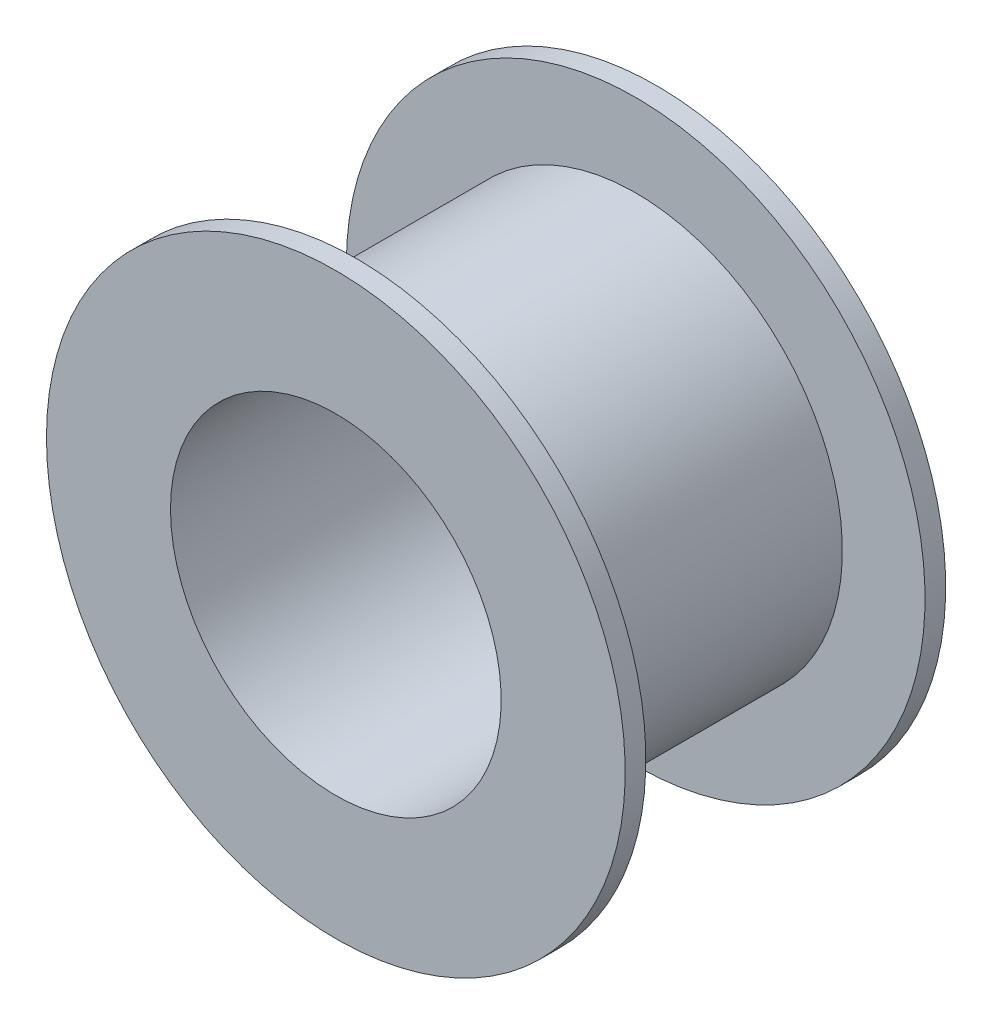
ISO-10303-21;
HEADER;
FILE_DESCRIPTION(('STEP AP214'),'2;1');
FILE_NAME('part.step','',(''),(''),'','','');
FILE_SCHEMA(('AUTOMOTIVE_DESIGN { 1 0 10303 214 1 1 1 1 }'));
ENDSEC;
DATA;
#1=APPLICATION_CONTEXT('core data for automotive mechanical design processes');
#2=APPLICATION_PROTOCOL_DEFINITION('international standard','automotive_design',2000,#1);
#3=PRODUCT_CONTEXT('',#1,'mechanical');
#4=PRODUCT('Part','Part','',(#3));
#5=PRODUCT_RELATED_PRODUCT_CATEGORY('part','',(#4));
#6=PRODUCT_DEFINITION_FORMATION('','',#4);
#7=PRODUCT_DEFINITION_CONTEXT('part definition',#1,'design');
#8=PRODUCT_DEFINITION('design','',#6,#7);
#9=PRODUCT_DEFINITION_SHAPE('','',#8);
#10=(LENGTH_UNIT() NAMED_UNIT(*) SI_UNIT(.MILLI.,.METRE.));
#11=(NAMED_UNIT(*) PLANE_ANGLE_UNIT() SI_UNIT($,.RADIAN.));
#12=(NAMED_UNIT(*) SI_UNIT($,.STERADIAN.) SOLID_ANGLE_UNIT());
#13=UNCERTAINTY_MEASURE_WITH_UNIT(LENGTH_MEASURE(1.E-05),#10,'distance_accuracy_value','');
#14=(GEOMETRIC_REPRESENTATION_CONTEXT(3) GLOBAL_UNCERTAINTY_ASSIGNED_CONTEXT((#13)) GLOBAL_UNIT_ASSIGNED_CONTEXT((#10,
#11,#12)) REPRESENTATION_CONTEXT('',''));
#15=CARTESIAN_POINT('',(0.,0.,0.));
#16=DIRECTION('',(0.,0.,1.));
#17=DIRECTION('',(1.,0.,0.));
#18=AXIS2_PLACEMENT_3D('',#15,#16,#17);
#19=CARTESIAN_POINT('',(0.,0.,0.));
#20=DIRECTION('',(0.,0.,-1.));
#21=DIRECTION('',(-1.,0.,0.));
#22=AXIS2_PLACEMENT_3D('',#19,#20,#21);
#23=CYLINDRICAL_SURFACE('',#22,50.8);
#24=CARTESIAN_POINT('',(0.,0.,98.4738461538463));
#25=DIRECTION('',(0.,0.,-1.));
#26=DIRECTION('',(-1.,0.,0.));
#27=AXIS2_PLACEMENT_3D('',#24,#25,#26);
#28=CIRCLE('',#27,50.8);
#29=CARTESIAN_POINT('',(-50.8,0.,98.4738461538463));
#30=VERTEX_POINT('',#29);
#31=EDGE_CURVE('E67',#30,#30,#28,.T.);
#32=ORIENTED_EDGE('',*,*,#31,.F.);
#33=EDGE_LOOP('',(#32));
#34=FACE_BOUND('',#33,.T.);
#35=CARTESIAN_POINT('',(0.,0.,0.));
#36=DIRECTION('',(0.,0.,-1.));
#37=DIRECTION('',(-1.,0.,0.));
#38=AXIS2_PLACEMENT_3D('',#35,#36,#37);
#39=CIRCLE('',#38,50.8);
#40=CARTESIAN_POINT('',(-50.8,0.,0.));
#41=VERTEX_POINT('',#40);
#42=EDGE_CURVE('E10',#41,#41,#39,.T.);
#43=ORIENTED_EDGE('',*,*,#42,.T.);
#44=EDGE_LOOP('',(#43));
#45=FACE_BOUND('',#44,.T.);
#46=ADVANCED_FACE('F39',(#34,#45),#23,.F.);
#47=CARTESIAN_POINT('',(0.,-50.8,0.));
#48=DIRECTION('',(0.,0.,1.));
#49=DIRECTION('',(1.,0.,0.));
#50=AXIS2_PLACEMENT_3D('',#47,#48,#49);
#51=PLANE('',#50);
#52=ORIENTED_EDGE('',*,*,#42,.F.);
#53=EDGE_LOOP('',(#52));
#54=FACE_BOUND('',#53,.T.);
#55=CARTESIAN_POINT('',(0.,0.,0.));
#56=DIRECTION('',(0.,0.,-1.));
#57=DIRECTION('',(-1.,0.,0.));
#58=AXIS2_PLACEMENT_3D('',#55,#56,#57);
#59=CIRCLE('',#58,88.9);
#60=CARTESIAN_POINT('',(-88.9,0.,0.));
#61=VERTEX_POINT('',#60);
#62=EDGE_CURVE('E45',#61,#61,#59,.T.);
#63=ORIENTED_EDGE('',*,*,#62,.T.);
#64=EDGE_LOOP('',(#63));
#65=FACE_BOUND('',#64,.T.);
#66=ADVANCED_FACE('F74',(#54,#65),#51,.F.);
#67=CARTESIAN_POINT('',(0.,0.,0.));
#68=DIRECTION('',(0.,0.,-1.));
#69=DIRECTION('',(-1.,0.,0.));
#70=AXIS2_PLACEMENT_3D('',#67,#68,#69);
#71=CYLINDRICAL_SURFACE('',#70,88.9);
#72=ORIENTED_EDGE('',*,*,#62,.F.);
#73=EDGE_LOOP('',(#72));
#74=FACE_BOUND('',#73,.T.);
#75=CARTESIAN_POINT('',(0.,0.,6.35));
#76=DIRECTION('',(0.,0.,-1.));
#77=DIRECTION('',(-1.,0.,0.));
#78=AXIS2_PLACEMENT_3D('',#75,#76,#77);
#79=CIRCLE('',#78,88.9);
#80=CARTESIAN_POINT('',(-88.9,0.,6.35));
#81=VERTEX_POINT('',#80);
#82=EDGE_CURVE('E49',#81,#81,#79,.T.);
#83=ORIENTED_EDGE('',*,*,#82,.T.);
#84=EDGE_LOOP('',(#83));
#85=FACE_BOUND('',#84,.T.);
#86=ADVANCED_FACE('F78',(#74,#85),#71,.T.);
#87=CARTESIAN_POINT('',(0.,-63.5,6.35));
#88=DIRECTION('',(0.,0.,-1.));
#89=DIRECTION('',(-1.,0.,0.));
#90=AXIS2_PLACEMENT_3D('',#87,#88,#89);
#91=PLANE('',#90);
#92=ORIENTED_EDGE('',*,*,#82,.F.);
#93=EDGE_LOOP('',(#92));
#94=FACE_BOUND('',#93,.T.);
#95=CARTESIAN_POINT('',(0.,0.,6.35));
#96=DIRECTION('',(0.,0.,-1.));
#97=DIRECTION('',(-1.,0.,0.));
#98=AXIS2_PLACEMENT_3D('',#95,#96,#97);
#99=CIRCLE('',#98,63.5);
#100=CARTESIAN_POINT('',(-63.5,0.,6.35));
#101=VERTEX_POINT('',#100);
#102=EDGE_CURVE('E53',#101,#101,#99,.T.);
#103=ORIENTED_EDGE('',*,*,#102,.T.);
#104=EDGE_LOOP('',(#103));
#105=FACE_BOUND('',#104,.T.);
#106=ADVANCED_FACE('F83',(#94,#105),#91,.F.);
#107=CARTESIAN_POINT('',(0.,0.,0.));
#108=DIRECTION('',(0.,0.,-1.));
#109=DIRECTION('',(-1.,0.,0.));
#110=AXIS2_PLACEMENT_3D('',#107,#108,#109);
#111=CYLINDRICAL_SURFACE('',#110,63.5);
#112=ORIENTED_EDGE('',*,*,#102,.F.);
#113=EDGE_LOOP('',(#112));
#114=FACE_BOUND('',#113,.T.);
#115=CARTESIAN_POINT('',(0.,0.,92.1238461538463));
#116=DIRECTION('',(0.,0.,-1.));
#117=DIRECTION('',(-1.,0.,0.));
#118=AXIS2_PLACEMENT_3D('',#115,#116,#117);
#119=CIRCLE('',#118,63.5);
#120=CARTESIAN_POINT('',(-63.5,0.,92.1238461538463));
#121=VERTEX_POINT('',#120);
#122=EDGE_CURVE('E58',#121,#121,#119,.T.);
#123=ORIENTED_EDGE('',*,*,#122,.T.);
#124=EDGE_LOOP('',(#123));
#125=FACE_BOUND('',#124,.T.);
#126=ADVANCED_FACE('F89',(#114,#125),#111,.T.);
#127=CARTESIAN_POINT('',(0.,-88.9,92.1238461538463));
#128=DIRECTION('',(0.,0.,1.));
#129=DIRECTION('',(1.,0.,0.));
#130=AXIS2_PLACEMENT_3D('',#127,#128,#129);
#131=PLANE('',#130);
#132=ORIENTED_EDGE('',*,*,#122,.F.);
#133=EDGE_LOOP('',(#132));
#134=FACE_BOUND('',#133,.T.);
#135=CARTESIAN_POINT('',(0.,0.,92.1238461538463));
#136=DIRECTION('',(0.,0.,-1.));
#137=DIRECTION('',(-1.,0.,0.));
#138=AXIS2_PLACEMENT_3D('',#135,#136,#137);
#139=CIRCLE('',#138,88.9);
#140=CARTESIAN_POINT('',(-88.9,0.,92.1238461538463));
#141=VERTEX_POINT('',#140);
#142=EDGE_CURVE('E61',#141,#141,#139,.T.);
#143=ORIENTED_EDGE('',*,*,#142,.T.);
#144=EDGE_LOOP('',(#143));
#145=FACE_BOUND('',#144,.T.);
#146=ADVANCED_FACE('F93',(#134,#145),#131,.F.);
#147=CARTESIAN_POINT('',(0.,0.,0.));
#148=DIRECTION('',(0.,0.,-1.));
#149=DIRECTION('',(-1.,0.,0.));
#150=AXIS2_PLACEMENT_3D('',#147,#148,#149);
#151=CYLINDRICAL_SURFACE('',#150,88.9);
#152=ORIENTED_EDGE('',*,*,#142,.F.);
#153=EDGE_LOOP('',(#152));
#154=FACE_BOUND('',#153,.T.);
#155=CARTESIAN_POINT('',(0.,0.,98.4738461538463));
#156=DIRECTION('',(0.,0.,-1.));
#157=DIRECTION('',(-1.,0.,0.));
#158=AXIS2_PLACEMENT_3D('',#155,#156,#157);
#159=CIRCLE('',#158,88.9);
#160=CARTESIAN_POINT('',(-88.9,0.,98.4738461538463));
#161=VERTEX_POINT('',#160);
#162=EDGE_CURVE('E64',#161,#161,#159,.T.);
#163=ORIENTED_EDGE('',*,*,#162,.T.);
#164=EDGE_LOOP('',(#163));
#165=FACE_BOUND('',#164,.T.);
#166=ADVANCED_FACE('F97',(#154,#165),#151,.T.);
#167=CARTESIAN_POINT('',(0.,-88.9,98.4738461538463));
#168=DIRECTION('',(0.,0.,-1.));
#169=DIRECTION('',(-1.,0.,0.));
#170=AXIS2_PLACEMENT_3D('',#167,#168,#169);
#171=PLANE('',#170);
#172=ORIENTED_EDGE('',*,*,#162,.F.);
#173=EDGE_LOOP('',(#172));
#174=FACE_BOUND('',#173,.T.);
#175=ORIENTED_EDGE('',*,*,#31,.T.);
#176=EDGE_LOOP('',(#175));
#177=FACE_BOUND('',#176,.T.);
#178=ADVANCED_FACE('F71',(#174,#177),#171,.F.);
#179=CLOSED_SHELL('',(#46,#66,#86,#106,#126,#146,#166,#178));
#180=MANIFOLD_SOLID_BREP('B2',#179);
#181=ADVANCED_BREP_SHAPE_REPRESENTATION('',(#18,#180),#14);
#182=SHAPE_DEFINITION_REPRESENTATION(#9,#181);
ENDSEC;
END-ISO-10303-21;
